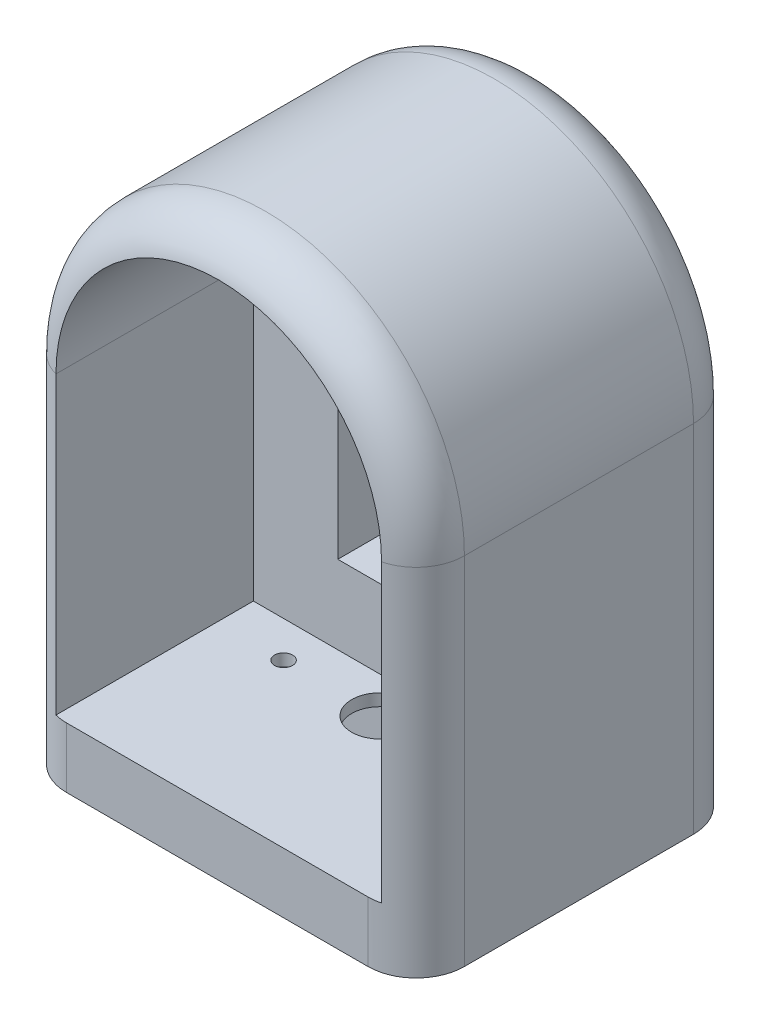
ISO-10303-21;
HEADER;
FILE_DESCRIPTION(('STEP AP214'),'2;1');
FILE_NAME('part.step','',(''),(''),'','','');
FILE_SCHEMA(('AUTOMOTIVE_DESIGN { 1 0 10303 214 1 1 1 1 }'));
ENDSEC;
DATA;
#1=APPLICATION_CONTEXT('core data for automotive mechanical design processes');
#2=APPLICATION_PROTOCOL_DEFINITION('international standard','automotive_design',2000,#1);
#3=PRODUCT_CONTEXT('',#1,'mechanical');
#4=PRODUCT('Part','Part','',(#3));
#5=PRODUCT_RELATED_PRODUCT_CATEGORY('part','',(#4));
#6=PRODUCT_DEFINITION_FORMATION('','',#4);
#7=PRODUCT_DEFINITION_CONTEXT('part definition',#1,'design');
#8=PRODUCT_DEFINITION('design','',#6,#7);
#9=PRODUCT_DEFINITION_SHAPE('','',#8);
#10=(LENGTH_UNIT() NAMED_UNIT(*) SI_UNIT(.MILLI.,.METRE.));
#11=(NAMED_UNIT(*) PLANE_ANGLE_UNIT() SI_UNIT($,.RADIAN.));
#12=(NAMED_UNIT(*) SI_UNIT($,.STERADIAN.) SOLID_ANGLE_UNIT());
#13=UNCERTAINTY_MEASURE_WITH_UNIT(LENGTH_MEASURE(1.E-05),#10,'distance_accuracy_value','');
#14=(GEOMETRIC_REPRESENTATION_CONTEXT(3) GLOBAL_UNCERTAINTY_ASSIGNED_CONTEXT((#13)) GLOBAL_UNIT_ASSIGNED_CONTEXT((#10,
#11,#12)) REPRESENTATION_CONTEXT('',''));
#15=CARTESIAN_POINT('',(0.,0.,0.));
#16=DIRECTION('',(0.,0.,1.));
#17=DIRECTION('',(1.,0.,0.));
#18=AXIS2_PLACEMENT_3D('',#15,#16,#17);
#19=CARTESIAN_POINT('',(-16.5,0.,-3.));
#20=DIRECTION('',(0.,0.,1.));
#21=DIRECTION('',(0.,-1.,0.));
#22=AXIS2_PLACEMENT_3D('',#19,#20,#21);
#23=PLANE('',#22);
#24=CARTESIAN_POINT('',(0.,36.8,-3.));
#25=DIRECTION('',(0.,0.,1.));
#26=DIRECTION('',(1.,0.,0.));
#27=AXIS2_PLACEMENT_3D('',#24,#25,#26);
#28=CIRCLE('',#27,1.);
#29=CARTESIAN_POINT('',(1.,36.8,-3.));
#30=VERTEX_POINT('',#29);
#31=EDGE_CURVE('E312',#30,#30,#28,.T.);
#32=ORIENTED_EDGE('',*,*,#31,.F.);
#33=EDGE_LOOP('',(#32));
#34=FACE_BOUND('',#33,.T.);
#35=CARTESIAN_POINT('',(0.,9.2,-3.));
#36=DIRECTION('',(0.,0.,1.));
#37=DIRECTION('',(1.,0.,0.));
#38=AXIS2_PLACEMENT_3D('',#35,#36,#37);
#39=CIRCLE('',#38,1.);
#40=CARTESIAN_POINT('',(1.,9.2,-3.));
#41=VERTEX_POINT('',#40);
#42=EDGE_CURVE('E315',#41,#41,#39,.T.);
#43=ORIENTED_EDGE('',*,*,#42,.F.);
#44=EDGE_LOOP('',(#43));
#45=FACE_BOUND('',#44,.T.);
#46=DIRECTION('',(0.,1.,0.));
#47=VECTOR('',#46,1.);
#48=CARTESIAN_POINT('',(6.5,11.5,-3.));
#49=LINE('',#48,#47);
#50=CARTESIAN_POINT('',(6.5,11.5,-3.));
#51=VERTEX_POINT('',#50);
#52=CARTESIAN_POINT('',(6.5,34.5,-3.));
#53=VERTEX_POINT('',#52);
#54=EDGE_CURVE('E322',#51,#53,#49,.T.);
#55=ORIENTED_EDGE('',*,*,#54,.F.);
#56=DIRECTION('',(1.,0.,0.));
#57=VECTOR('',#56,1.);
#58=CARTESIAN_POINT('',(-6.5,11.5,-3.));
#59=LINE('',#58,#57);
#60=CARTESIAN_POINT('',(-6.5,11.5,-3.));
#61=VERTEX_POINT('',#60);
#62=EDGE_CURVE('E344',#61,#51,#59,.T.);
#63=ORIENTED_EDGE('',*,*,#62,.F.);
#64=DIRECTION('',(0.,-1.,0.));
#65=VECTOR('',#64,1.);
#66=CARTESIAN_POINT('',(-6.5,11.5,-3.));
#67=LINE('',#66,#65);
#68=CARTESIAN_POINT('',(-6.5,34.5,-3.));
#69=VERTEX_POINT('',#68);
#70=EDGE_CURVE('E342',#69,#61,#67,.T.);
#71=ORIENTED_EDGE('',*,*,#70,.F.);
#72=DIRECTION('',(-1.,0.,0.));
#73=VECTOR('',#72,1.);
#74=CARTESIAN_POINT('',(-6.5,34.5,-3.));
#75=LINE('',#74,#73);
#76=EDGE_CURVE('E340',#53,#69,#75,.T.);
#77=ORIENTED_EDGE('',*,*,#76,.F.);
#78=EDGE_LOOP('',(#55,#63,#71,#77));
#79=FACE_BOUND('',#78,.T.);
#80=DIRECTION('',(1.,0.,0.));
#81=VECTOR('',#80,1.);
#82=CARTESIAN_POINT('',(-16.5,5.,-3.));
#83=LINE('',#82,#81);
#84=CARTESIAN_POINT('',(-13.5,5.,-3.));
#85=VERTEX_POINT('',#84);
#86=CARTESIAN_POINT('',(13.5,5.,-3.));
#87=VERTEX_POINT('',#86);
#88=EDGE_CURVE('E358',#85,#87,#83,.T.);
#89=ORIENTED_EDGE('',*,*,#88,.T.);
#90=DIRECTION('',(0.,-1.,0.));
#91=VECTOR('',#90,1.);
#92=CARTESIAN_POINT('',(13.5,8.,-3.));
#93=LINE('',#92,#91);
#94=CARTESIAN_POINT('',(13.5,29.5,-3.));
#95=VERTEX_POINT('',#94);
#96=EDGE_CURVE('E296',#95,#87,#93,.T.);
#97=ORIENTED_EDGE('',*,*,#96,.F.);
#98=CARTESIAN_POINT('',(0.,29.5,-3.));
#99=DIRECTION('',(0.,0.,-1.));
#100=DIRECTION('',(1.,0.,0.));
#101=AXIS2_PLACEMENT_3D('',#98,#99,#100);
#102=CIRCLE('',#101,13.5);
#103=CARTESIAN_POINT('',(-13.5,29.5,-3.));
#104=VERTEX_POINT('',#103);
#105=EDGE_CURVE('E292',#104,#95,#102,.T.);
#106=ORIENTED_EDGE('',*,*,#105,.F.);
#107=DIRECTION('',(0.,1.,0.));
#108=VECTOR('',#107,1.);
#109=CARTESIAN_POINT('',(-13.5,29.5,-3.));
#110=LINE('',#109,#108);
#111=EDGE_CURVE('E289',#85,#104,#110,.T.);
#112=ORIENTED_EDGE('',*,*,#111,.F.);
#113=EDGE_LOOP('',(#89,#97,#106,#112));
#114=FACE_BOUND('',#113,.T.);
#115=ADVANCED_FACE('F41',(#34,#45,#79,#114),#23,.T.);
#116=CARTESIAN_POINT('',(-16.5,5.,0.));
#117=DIRECTION('',(0.,-1.,0.));
#118=DIRECTION('',(0.,0.,-1.));
#119=AXIS2_PLACEMENT_3D('',#116,#117,#118);
#120=PLANE('',#119);
#121=CARTESIAN_POINT('',(8.,5.,0.));
#122=DIRECTION('',(0.,-1.,0.));
#123=DIRECTION('',(0.,0.,-1.));
#124=AXIS2_PLACEMENT_3D('',#121,#122,#123);
#125=CIRCLE('',#124,0.75);
#126=CARTESIAN_POINT('',(8.,5.,-0.75));
#127=VERTEX_POINT('',#126);
#128=EDGE_CURVE('E998',#127,#127,#125,.T.);
#129=ORIENTED_EDGE('',*,*,#128,.T.);
#130=EDGE_LOOP('',(#129));
#131=FACE_BOUND('',#130,.T.);
#132=CARTESIAN_POINT('',(-8.,5.,0.));
#133=DIRECTION('',(0.,-1.,0.));
#134=DIRECTION('',(0.,0.,-1.));
#135=AXIS2_PLACEMENT_3D('',#132,#133,#134);
#136=CIRCLE('',#135,0.75);
#137=CARTESIAN_POINT('',(-8.,5.,-0.75));
#138=VERTEX_POINT('',#137);
#139=EDGE_CURVE('E999',#138,#138,#136,.T.);
#140=ORIENTED_EDGE('',*,*,#139,.T.);
#141=EDGE_LOOP('',(#140));
#142=FACE_BOUND('',#141,.T.);
#143=CARTESIAN_POINT('',(0.,5.,0.));
#144=DIRECTION('',(0.,1.,0.));
#145=DIRECTION('',(0.,0.,1.));
#146=AXIS2_PLACEMENT_3D('',#143,#144,#145);
#147=CIRCLE('',#146,2.35);
#148=CARTESIAN_POINT('',(0.,5.,2.35));
#149=VERTEX_POINT('',#148);
#150=EDGE_CURVE('E241',#149,#149,#147,.T.);
#151=ORIENTED_EDGE('',*,*,#150,.F.);
#152=EDGE_LOOP('',(#151));
#153=FACE_BOUND('',#152,.T.);
#154=DIRECTION('',(0.,0.,-1.));
#155=VECTOR('',#154,1.);
#156=CARTESIAN_POINT('',(-13.5,5.,66.1307894677631));
#157=LINE('',#156,#155);
#158=CARTESIAN_POINT('',(-13.5,5.,13.3729833462074));
#159=VERTEX_POINT('',#158);
#160=EDGE_CURVE('E305',#159,#85,#157,.T.);
#161=ORIENTED_EDGE('',*,*,#160,.F.);
#162=CARTESIAN_POINT('',(-12.5,5.,9.5));
#163=DIRECTION('',(0.,-1.,0.));
#164=DIRECTION('',(0.,0.,-1.));
#165=AXIS2_PLACEMENT_3D('',#162,#163,#164);
#166=CIRCLE('',#165,4.);
#167=CARTESIAN_POINT('',(-12.5,5.,13.5));
#168=VERTEX_POINT('',#167);
#169=EDGE_CURVE('E414',#159,#168,#166,.F.);
#170=ORIENTED_EDGE('',*,*,#169,.T.);
#171=DIRECTION('',(1.,0.,0.));
#172=VECTOR('',#171,1.);
#173=CARTESIAN_POINT('',(-16.5,5.,13.5));
#174=LINE('',#173,#172);
#175=CARTESIAN_POINT('',(12.5,5.,13.5));
#176=VERTEX_POINT('',#175);
#177=EDGE_CURVE('E349',#168,#176,#174,.T.);
#178=ORIENTED_EDGE('',*,*,#177,.T.);
#179=CARTESIAN_POINT('',(12.5,5.,9.5));
#180=DIRECTION('',(0.,-1.,0.));
#181=DIRECTION('',(0.,0.,-1.));
#182=AXIS2_PLACEMENT_3D('',#179,#180,#181);
#183=CIRCLE('',#182,4.);
#184=CARTESIAN_POINT('',(13.5,5.,13.3729833462074));
#185=VERTEX_POINT('',#184);
#186=EDGE_CURVE('E412',#176,#185,#183,.F.);
#187=ORIENTED_EDGE('',*,*,#186,.T.);
#188=DIRECTION('',(0.,0.,-1.));
#189=VECTOR('',#188,1.);
#190=CARTESIAN_POINT('',(13.5,5.,66.1307894677631));
#191=LINE('',#190,#189);
#192=EDGE_CURVE('E299',#185,#87,#191,.T.);
#193=ORIENTED_EDGE('',*,*,#192,.T.);
#194=ORIENTED_EDGE('',*,*,#88,.F.);
#195=EDGE_LOOP('',(#161,#170,#178,#187,#193,#194));
#196=FACE_BOUND('',#195,.T.);
#197=ADVANCED_FACE('F515',(#131,#142,#153,#196),#120,.F.);
#198=CARTESIAN_POINT('',(0.,0.,-12.));
#199=DIRECTION('',(0.,0.,-1.));
#200=DIRECTION('',(-1.,0.,0.));
#201=AXIS2_PLACEMENT_3D('',#198,#199,#200);
#202=PLANE('',#201);
#203=DIRECTION('',(0.,-1.,0.));
#204=VECTOR('',#203,1.);
#205=CARTESIAN_POINT('',(-6.5,11.5,-12.));
#206=LINE('',#205,#204);
#207=CARTESIAN_POINT('',(-6.5,34.5,-12.));
#208=VERTEX_POINT('',#207);
#209=CARTESIAN_POINT('',(-6.5,28.,-12.));
#210=VERTEX_POINT('',#209);
#211=EDGE_CURVE('E332',#208,#210,#206,.T.);
#212=ORIENTED_EDGE('',*,*,#211,.T.);
#213=CARTESIAN_POINT('',(0.,28.,-12.));
#214=DIRECTION('',(0.,0.,-1.));
#215=DIRECTION('',(-1.,0.,0.));
#216=AXIS2_PLACEMENT_3D('',#213,#214,#215);
#217=CIRCLE('',#216,6.5);
#218=CARTESIAN_POINT('',(0.,34.5,-12.));
#219=VERTEX_POINT('',#218);
#220=EDGE_CURVE('E383',#210,#219,#217,.T.);
#221=ORIENTED_EDGE('',*,*,#220,.T.);
#222=DIRECTION('',(-1.,0.,0.));
#223=VECTOR('',#222,1.);
#224=CARTESIAN_POINT('',(-6.5,34.5,-12.));
#225=LINE('',#224,#223);
#226=EDGE_CURVE('E326',#219,#208,#225,.T.);
#227=ORIENTED_EDGE('',*,*,#226,.T.);
#228=EDGE_LOOP('',(#212,#221,#227));
#229=FACE_BOUND('',#228,.T.);
#230=ADVANCED_FACE('F513',(#229),#202,.F.);
#231=CARTESIAN_POINT('',(6.5,34.5,-12.));
#232=VERTEX_POINT('',#231);
#233=EDGE_CURVE('E328',#232,#219,#225,.T.);
#234=ORIENTED_EDGE('',*,*,#233,.T.);
#235=CARTESIAN_POINT('',(6.5,28.,-12.));
#236=VERTEX_POINT('',#235);
#237=EDGE_CURVE('E382',#219,#236,#217,.T.);
#238=ORIENTED_EDGE('',*,*,#237,.T.);
#239=DIRECTION('',(0.,1.,0.));
#240=VECTOR('',#239,1.);
#241=CARTESIAN_POINT('',(6.5,11.5,-12.));
#242=LINE('',#241,#240);
#243=EDGE_CURVE('E327',#236,#232,#242,.T.);
#244=ORIENTED_EDGE('',*,*,#243,.T.);
#245=EDGE_LOOP('',(#234,#238,#244));
#246=FACE_BOUND('',#245,.T.);
#247=ADVANCED_FACE('F489',(#246),#202,.F.);
#248=CARTESIAN_POINT('',(0.,29.5,-3.));
#249=DIRECTION('',(0.,0.,1.));
#250=DIRECTION('',(1.,0.,0.));
#251=AXIS2_PLACEMENT_3D('',#248,#249,#250);
#252=CYLINDRICAL_SURFACE('',#251,16.5);
#253=DIRECTION('',(0.,0.,1.));
#254=VECTOR('',#253,1.);
#255=CARTESIAN_POINT('',(-16.5,29.5,13.5));
#256=LINE('',#255,#254);
#257=CARTESIAN_POINT('',(-16.5,29.5,9.5));
#258=VERTEX_POINT('',#257);
#259=CARTESIAN_POINT('',(-16.5,29.5,-9.5));
#260=VERTEX_POINT('',#259);
#261=EDGE_CURVE('E373',#258,#260,#256,.F.);
#262=ORIENTED_EDGE('',*,*,#261,.F.);
#263=CARTESIAN_POINT('',(0.,29.5,9.5));
#264=DIRECTION('',(0.,0.,-1.));
#265=DIRECTION('',(-1.,0.,0.));
#266=AXIS2_PLACEMENT_3D('',#263,#264,#265);
#267=CIRCLE('',#266,16.5);
#268=CARTESIAN_POINT('',(16.5,29.5,9.5));
#269=VERTEX_POINT('',#268);
#270=EDGE_CURVE('E50',#258,#269,#267,.T.);
#271=ORIENTED_EDGE('',*,*,#270,.T.);
#272=DIRECTION('',(0.,0.,1.));
#273=VECTOR('',#272,1.);
#274=CARTESIAN_POINT('',(16.5,29.5,13.5));
#275=LINE('',#274,#273);
#276=CARTESIAN_POINT('',(16.5,29.5,-9.5));
#277=VERTEX_POINT('',#276);
#278=EDGE_CURVE('E376',#277,#269,#275,.T.);
#279=ORIENTED_EDGE('',*,*,#278,.F.);
#280=CARTESIAN_POINT('',(0.,29.5,-9.5));
#281=DIRECTION('',(0.,0.,1.));
#282=DIRECTION('',(1.,0.,0.));
#283=AXIS2_PLACEMENT_3D('',#280,#281,#282);
#284=CIRCLE('',#283,16.5);
#285=EDGE_CURVE('E419',#277,#260,#284,.T.);
#286=ORIENTED_EDGE('',*,*,#285,.T.);
#287=EDGE_LOOP('',(#262,#271,#279,#286));
#288=FACE_BOUND('',#287,.T.);
#289=ADVANCED_FACE('F457',(#288),#252,.T.);
#290=CARTESIAN_POINT('',(16.5,46.,13.5));
#291=DIRECTION('',(-1.,0.,0.));
#292=DIRECTION('',(0.,0.,1.));
#293=AXIS2_PLACEMENT_3D('',#290,#291,#292);
#294=PLANE('',#293);
#295=DIRECTION('',(0.,0.,-1.));
#296=VECTOR('',#295,1.);
#297=CARTESIAN_POINT('',(16.5,0.,13.5));
#298=LINE('',#297,#296);
#299=CARTESIAN_POINT('',(16.5,0.,9.5));
#300=VERTEX_POINT('',#299);
#301=CARTESIAN_POINT('',(16.5,0.,-9.5));
#302=VERTEX_POINT('',#301);
#303=EDGE_CURVE('E361',#300,#302,#298,.T.);
#304=ORIENTED_EDGE('',*,*,#303,.T.);
#305=DIRECTION('',(0.,-1.,0.));
#306=VECTOR('',#305,1.);
#307=CARTESIAN_POINT('',(16.5,46.,-9.5));
#308=LINE('',#307,#306);
#309=EDGE_CURVE('E405',#302,#277,#308,.F.);
#310=ORIENTED_EDGE('',*,*,#309,.T.);
#311=ORIENTED_EDGE('',*,*,#278,.T.);
#312=DIRECTION('',(0.,-1.,0.));
#313=VECTOR('',#312,1.);
#314=CARTESIAN_POINT('',(16.5,46.,9.5));
#315=LINE('',#314,#313);
#316=EDGE_CURVE('E403',#269,#300,#315,.T.);
#317=ORIENTED_EDGE('',*,*,#316,.T.);
#318=EDGE_LOOP('',(#304,#310,#311,#317));
#319=FACE_BOUND('',#318,.T.);
#320=ADVANCED_FACE('F441',(#319),#294,.F.);
#321=CARTESIAN_POINT('',(-16.5,46.,13.5));
#322=DIRECTION('',(1.,0.,0.));
#323=DIRECTION('',(0.,0.,-1.));
#324=AXIS2_PLACEMENT_3D('',#321,#322,#323);
#325=PLANE('',#324);
#326=ORIENTED_EDGE('',*,*,#261,.T.);
#327=DIRECTION('',(0.,-1.,0.));
#328=VECTOR('',#327,1.);
#329=CARTESIAN_POINT('',(-16.5,46.,-9.5));
#330=LINE('',#329,#328);
#331=CARTESIAN_POINT('',(-16.5,0.,-9.5));
#332=VERTEX_POINT('',#331);
#333=EDGE_CURVE('E386',#260,#332,#330,.T.);
#334=ORIENTED_EDGE('',*,*,#333,.T.);
#335=DIRECTION('',(0.,0.,1.));
#336=VECTOR('',#335,1.);
#337=CARTESIAN_POINT('',(-16.5,0.,13.5));
#338=LINE('',#337,#336);
#339=CARTESIAN_POINT('',(-16.5,0.,9.5));
#340=VERTEX_POINT('',#339);
#341=EDGE_CURVE('E368',#332,#340,#338,.T.);
#342=ORIENTED_EDGE('',*,*,#341,.T.);
#343=DIRECTION('',(0.,-1.,0.));
#344=VECTOR('',#343,1.);
#345=CARTESIAN_POINT('',(-16.5,46.,9.5));
#346=LINE('',#345,#344);
#347=EDGE_CURVE('E384',#340,#258,#346,.F.);
#348=ORIENTED_EDGE('',*,*,#347,.T.);
#349=EDGE_LOOP('',(#326,#334,#342,#348));
#350=FACE_BOUND('',#349,.T.);
#351=ADVANCED_FACE('F460',(#350),#325,.F.);
#352=CARTESIAN_POINT('',(-16.5,46.,-13.5));
#353=DIRECTION('',(0.,0.,1.));
#354=DIRECTION('',(1.,0.,0.));
#355=AXIS2_PLACEMENT_3D('',#352,#353,#354);
#356=PLANE('',#355);
#357=DIRECTION('',(-1.,0.,0.));
#358=VECTOR('',#357,1.);
#359=CARTESIAN_POINT('',(-16.5,0.,-13.5));
#360=LINE('',#359,#358);
#361=CARTESIAN_POINT('',(12.5,0.,-13.5));
#362=VERTEX_POINT('',#361);
#363=CARTESIAN_POINT('',(-12.5,0.,-13.5));
#364=VERTEX_POINT('',#363);
#365=EDGE_CURVE('E365',#362,#364,#360,.T.);
#366=ORIENTED_EDGE('',*,*,#365,.T.);
#367=DIRECTION('',(0.,-1.,0.));
#368=VECTOR('',#367,1.);
#369=CARTESIAN_POINT('',(-12.5,46.,-13.5));
#370=LINE('',#369,#368);
#371=CARTESIAN_POINT('',(-12.5,29.5,-13.5));
#372=VERTEX_POINT('',#371);
#373=EDGE_CURVE('E401',#364,#372,#370,.F.);
#374=ORIENTED_EDGE('',*,*,#373,.T.);
#375=CARTESIAN_POINT('',(0.,29.5,-13.5));
#376=DIRECTION('',(0.,0.,1.));
#377=DIRECTION('',(1.,0.,0.));
#378=AXIS2_PLACEMENT_3D('',#375,#376,#377);
#379=CIRCLE('',#378,12.5);
#380=CARTESIAN_POINT('',(12.5,29.5,-13.5));
#381=VERTEX_POINT('',#380);
#382=EDGE_CURVE('E397',#372,#381,#379,.F.);
#383=ORIENTED_EDGE('',*,*,#382,.T.);
#384=DIRECTION('',(0.,-1.,0.));
#385=VECTOR('',#384,1.);
#386=CARTESIAN_POINT('',(12.5,46.,-13.5));
#387=LINE('',#386,#385);
#388=EDGE_CURVE('E399',#381,#362,#387,.T.);
#389=ORIENTED_EDGE('',*,*,#388,.T.);
#390=EDGE_LOOP('',(#366,#374,#383,#389));
#391=FACE_BOUND('',#390,.T.);
#392=CARTESIAN_POINT('',(0.,28.,-13.5));
#393=DIRECTION('',(0.,0.,1.));
#394=DIRECTION('',(1.,0.,0.));
#395=AXIS2_PLACEMENT_3D('',#392,#393,#394);
#396=CIRCLE('',#395,6.5);
#397=CARTESIAN_POINT('',(6.5,28.,-13.5));
#398=VERTEX_POINT('',#397);
#399=EDGE_CURVE('E311',#398,#398,#396,.T.);
#400=ORIENTED_EDGE('',*,*,#399,.T.);
#401=EDGE_LOOP('',(#400));
#402=FACE_BOUND('',#401,.T.);
#403=ADVANCED_FACE('F470',(#391,#402),#356,.F.);
#404=CARTESIAN_POINT('',(-16.5,46.,13.5));
#405=DIRECTION('',(0.,0.,-1.));
#406=DIRECTION('',(-1.,0.,0.));
#407=AXIS2_PLACEMENT_3D('',#404,#405,#406);
#408=PLANE('',#407);
#409=ORIENTED_EDGE('',*,*,#177,.F.);
#410=DIRECTION('',(0.,-1.,0.));
#411=VECTOR('',#410,1.);
#412=CARTESIAN_POINT('',(-12.5,46.,13.5));
#413=LINE('',#412,#411);
#414=CARTESIAN_POINT('',(-12.5,0.,13.5));
#415=VERTEX_POINT('',#414);
#416=EDGE_CURVE('E417',#168,#415,#413,.T.);
#417=ORIENTED_EDGE('',*,*,#416,.T.);
#418=DIRECTION('',(1.,0.,0.));
#419=VECTOR('',#418,1.);
#420=CARTESIAN_POINT('',(-16.5,0.,13.5));
#421=LINE('',#420,#419);
#422=CARTESIAN_POINT('',(12.5,0.,13.5));
#423=VERTEX_POINT('',#422);
#424=EDGE_CURVE('E371',#415,#423,#421,.T.);
#425=ORIENTED_EDGE('',*,*,#424,.T.);
#426=DIRECTION('',(0.,-1.,0.));
#427=VECTOR('',#426,1.);
#428=CARTESIAN_POINT('',(12.5,46.,13.5));
#429=LINE('',#428,#427);
#430=EDGE_CURVE('E66',#423,#176,#429,.F.);
#431=ORIENTED_EDGE('',*,*,#430,.T.);
#432=EDGE_LOOP('',(#409,#417,#425,#431));
#433=FACE_BOUND('',#432,.T.);
#434=ADVANCED_FACE('F473',(#433),#408,.F.);
#435=CARTESIAN_POINT('',(0.,0.,0.));
#436=DIRECTION('',(0.,-1.,0.));
#437=DIRECTION('',(0.,0.,-1.));
#438=AXIS2_PLACEMENT_3D('',#435,#436,#437);
#439=PLANE('',#438);
#440=CARTESIAN_POINT('',(14.,0.,0.));
#441=DIRECTION('',(0.,-1.,0.));
#442=DIRECTION('',(0.,0.,-1.));
#443=AXIS2_PLACEMENT_3D('',#440,#441,#442);
#444=CIRCLE('',#443,1.75);
#445=CARTESIAN_POINT('',(14.09375,0.,-1.74748703500198));
#446=VERTEX_POINT('',#445);
#447=CARTESIAN_POINT('',(14.09375,0.,1.74748703500198));
#448=VERTEX_POINT('',#447);
#449=EDGE_CURVE('E58',#446,#448,#444,.T.);
#450=ORIENTED_EDGE('',*,*,#449,.F.);
#451=DIRECTION('',(0.99856402000113,0.,0.0535714285714287));
#452=VECTOR('',#451,1.);
#453=CARTESIAN_POINT('',(14.09375,0.,-1.74748703500198));
#454=LINE('',#453,#452);
#455=CARTESIAN_POINT('',(0.133928571428572,0.,-2.49641005000282));
#456=VERTEX_POINT('',#455);
#457=EDGE_CURVE('E235',#456,#446,#454,.T.);
#458=ORIENTED_EDGE('',*,*,#457,.F.);
#459=CARTESIAN_POINT('',(0.,0.,0.));
#460=DIRECTION('',(0.,-1.,0.));
#461=DIRECTION('',(0.,0.,-1.));
#462=AXIS2_PLACEMENT_3D('',#459,#460,#461);
#463=CIRCLE('',#462,2.5);
#464=CARTESIAN_POINT('',(-0.133928571428571,0.,-2.49641005000282));
#465=VERTEX_POINT('',#464);
#466=EDGE_CURVE('E238',#465,#456,#463,.T.);
#467=ORIENTED_EDGE('',*,*,#466,.F.);
#468=DIRECTION('',(0.99856402000113,0.,-0.0535714285714285));
#469=VECTOR('',#468,1.);
#470=CARTESIAN_POINT('',(-0.133928571428571,0.,-2.49641005000282));
#471=LINE('',#470,#469);
#472=CARTESIAN_POINT('',(-14.09375,0.,-1.74748703500198));
#473=VERTEX_POINT('',#472);
#474=EDGE_CURVE('E270',#473,#465,#471,.T.);
#475=ORIENTED_EDGE('',*,*,#474,.F.);
#476=CARTESIAN_POINT('',(-14.,0.,0.));
#477=DIRECTION('',(0.,-1.,0.));
#478=DIRECTION('',(0.,0.,-1.));
#479=AXIS2_PLACEMENT_3D('',#476,#477,#478);
#480=CIRCLE('',#479,1.75);
#481=CARTESIAN_POINT('',(-14.09375,0.,1.74748703500198));
#482=VERTEX_POINT('',#481);
#483=EDGE_CURVE('E267',#482,#473,#480,.T.);
#484=ORIENTED_EDGE('',*,*,#483,.F.);
#485=DIRECTION('',(-0.99856402000113,0.,-0.0535714285714286));
#486=VECTOR('',#485,1.);
#487=CARTESIAN_POINT('',(-14.09375,0.,1.74748703500198));
#488=LINE('',#487,#486);
#489=CARTESIAN_POINT('',(-0.133928571428571,0.,2.49641005000282));
#490=VERTEX_POINT('',#489);
#491=EDGE_CURVE('E264',#490,#482,#488,.T.);
#492=ORIENTED_EDGE('',*,*,#491,.F.);
#493=CARTESIAN_POINT('',(0.,0.,0.));
#494=DIRECTION('',(0.,-1.,0.));
#495=DIRECTION('',(0.,0.,-1.));
#496=AXIS2_PLACEMENT_3D('',#493,#494,#495);
#497=CIRCLE('',#496,2.5);
#498=CARTESIAN_POINT('',(0.133928571428571,0.,2.49641005000282));
#499=VERTEX_POINT('',#498);
#500=EDGE_CURVE('E261',#499,#490,#497,.T.);
#501=ORIENTED_EDGE('',*,*,#500,.F.);
#502=DIRECTION('',(-0.99856402000113,0.,0.0535714285714286));
#503=VECTOR('',#502,1.);
#504=CARTESIAN_POINT('',(0.133928571428571,0.,2.49641005000282));
#505=LINE('',#504,#503);
#506=EDGE_CURVE('E258',#448,#499,#505,.T.);
#507=ORIENTED_EDGE('',*,*,#506,.F.);
#508=EDGE_LOOP('',(#450,#458,#467,#475,#484,#492,#501,#507));
#509=FACE_BOUND('',#508,.T.);
#510=ORIENTED_EDGE('',*,*,#341,.F.);
#511=CARTESIAN_POINT('',(-12.5,0.,-9.5));
#512=DIRECTION('',(0.,-1.,0.));
#513=DIRECTION('',(0.,0.,-1.));
#514=AXIS2_PLACEMENT_3D('',#511,#512,#513);
#515=CIRCLE('',#514,4.);
#516=EDGE_CURVE('E395',#332,#364,#515,.T.);
#517=ORIENTED_EDGE('',*,*,#516,.T.);
#518=ORIENTED_EDGE('',*,*,#365,.F.);
#519=CARTESIAN_POINT('',(12.5,0.,-9.5));
#520=DIRECTION('',(0.,-1.,0.));
#521=DIRECTION('',(0.,0.,-1.));
#522=AXIS2_PLACEMENT_3D('',#519,#520,#521);
#523=CIRCLE('',#522,4.);
#524=EDGE_CURVE('E393',#362,#302,#523,.T.);
#525=ORIENTED_EDGE('',*,*,#524,.T.);
#526=ORIENTED_EDGE('',*,*,#303,.F.);
#527=CARTESIAN_POINT('',(12.5,0.,9.5));
#528=DIRECTION('',(0.,-1.,0.));
#529=DIRECTION('',(0.,0.,-1.));
#530=AXIS2_PLACEMENT_3D('',#527,#528,#529);
#531=CIRCLE('',#530,4.);
#532=EDGE_CURVE('E389',#300,#423,#531,.T.);
#533=ORIENTED_EDGE('',*,*,#532,.T.);
#534=ORIENTED_EDGE('',*,*,#424,.F.);
#535=CARTESIAN_POINT('',(-12.5,0.,9.5));
#536=DIRECTION('',(0.,-1.,0.));
#537=DIRECTION('',(0.,0.,-1.));
#538=AXIS2_PLACEMENT_3D('',#535,#536,#537);
#539=CIRCLE('',#538,4.);
#540=EDGE_CURVE('E391',#415,#340,#539,.T.);
#541=ORIENTED_EDGE('',*,*,#540,.T.);
#542=EDGE_LOOP('',(#510,#517,#518,#525,#526,#533,#534,#541));
#543=FACE_BOUND('',#542,.T.);
#544=ADVANCED_FACE('F446',(#509,#543),#439,.T.);
#545=CARTESIAN_POINT('',(6.5,11.5,-12.));
#546=DIRECTION('',(1.,0.,0.));
#547=DIRECTION('',(0.,0.,-1.));
#548=AXIS2_PLACEMENT_3D('',#545,#546,#547);
#549=PLANE('',#548);
#550=ORIENTED_EDGE('',*,*,#243,.F.);
#551=CARTESIAN_POINT('',(6.5,11.5,-12.));
#552=VERTEX_POINT('',#551);
#553=EDGE_CURVE('E323',#552,#236,#242,.T.);
#554=ORIENTED_EDGE('',*,*,#553,.F.);
#555=DIRECTION('',(0.,0.,1.));
#556=VECTOR('',#555,1.);
#557=CARTESIAN_POINT('',(6.5,11.5,-12.));
#558=LINE('',#557,#556);
#559=EDGE_CURVE('E347',#552,#51,#558,.T.);
#560=ORIENTED_EDGE('',*,*,#559,.T.);
#561=ORIENTED_EDGE('',*,*,#54,.T.);
#562=DIRECTION('',(0.,0.,1.));
#563=VECTOR('',#562,1.);
#564=CARTESIAN_POINT('',(6.5,34.5,-12.));
#565=LINE('',#564,#563);
#566=EDGE_CURVE('E338',#232,#53,#565,.T.);
#567=ORIENTED_EDGE('',*,*,#566,.F.);
#568=EDGE_LOOP('',(#550,#554,#560,#561,#567));
#569=FACE_BOUND('',#568,.T.);
#570=ADVANCED_FACE('F494',(#569),#549,.F.);
#571=CARTESIAN_POINT('',(-6.5,11.5,-12.));
#572=DIRECTION('',(0.,-1.,0.));
#573=DIRECTION('',(0.,0.,-1.));
#574=AXIS2_PLACEMENT_3D('',#571,#572,#573);
#575=PLANE('',#574);
#576=ORIENTED_EDGE('',*,*,#62,.T.);
#577=ORIENTED_EDGE('',*,*,#559,.F.);
#578=DIRECTION('',(1.,0.,0.));
#579=VECTOR('',#578,1.);
#580=CARTESIAN_POINT('',(-6.5,11.5,-12.));
#581=LINE('',#580,#579);
#582=CARTESIAN_POINT('',(-6.5,11.5,-12.));
#583=VERTEX_POINT('',#582);
#584=EDGE_CURVE('E335',#583,#552,#581,.T.);
#585=ORIENTED_EDGE('',*,*,#584,.F.);
#586=DIRECTION('',(0.,0.,1.));
#587=VECTOR('',#586,1.);
#588=CARTESIAN_POINT('',(-6.5,11.5,-12.));
#589=LINE('',#588,#587);
#590=EDGE_CURVE('E350',#583,#61,#589,.T.);
#591=ORIENTED_EDGE('',*,*,#590,.T.);
#592=EDGE_LOOP('',(#576,#577,#585,#591));
#593=FACE_BOUND('',#592,.T.);
#594=ADVANCED_FACE('F498',(#593),#575,.F.);
#595=CARTESIAN_POINT('',(-6.5,11.5,-12.));
#596=DIRECTION('',(-1.,0.,0.));
#597=DIRECTION('',(0.,0.,1.));
#598=AXIS2_PLACEMENT_3D('',#595,#596,#597);
#599=PLANE('',#598);
#600=EDGE_CURVE('E331',#210,#583,#206,.T.);
#601=ORIENTED_EDGE('',*,*,#600,.F.);
#602=ORIENTED_EDGE('',*,*,#211,.F.);
#603=DIRECTION('',(0.,0.,1.));
#604=VECTOR('',#603,1.);
#605=CARTESIAN_POINT('',(-6.5,34.5,-12.));
#606=LINE('',#605,#604);
#607=EDGE_CURVE('E353',#208,#69,#606,.T.);
#608=ORIENTED_EDGE('',*,*,#607,.T.);
#609=ORIENTED_EDGE('',*,*,#70,.T.);
#610=ORIENTED_EDGE('',*,*,#590,.F.);
#611=EDGE_LOOP('',(#601,#602,#608,#609,#610));
#612=FACE_BOUND('',#611,.T.);
#613=ADVANCED_FACE('F510',(#612),#599,.F.);
#614=CARTESIAN_POINT('',(-6.5,34.5,-12.));
#615=DIRECTION('',(0.,1.,0.));
#616=DIRECTION('',(0.,0.,1.));
#617=AXIS2_PLACEMENT_3D('',#614,#615,#616);
#618=PLANE('',#617);
#619=ORIENTED_EDGE('',*,*,#226,.F.);
#620=ORIENTED_EDGE('',*,*,#233,.F.);
#621=ORIENTED_EDGE('',*,*,#566,.T.);
#622=ORIENTED_EDGE('',*,*,#76,.T.);
#623=ORIENTED_EDGE('',*,*,#607,.F.);
#624=EDGE_LOOP('',(#619,#620,#621,#622,#623));
#625=FACE_BOUND('',#624,.T.);
#626=ADVANCED_FACE('F505',(#625),#618,.F.);
#627=ORIENTED_EDGE('',*,*,#553,.T.);
#628=EDGE_CURVE('E379',#236,#210,#217,.T.);
#629=ORIENTED_EDGE('',*,*,#628,.T.);
#630=ORIENTED_EDGE('',*,*,#600,.T.);
#631=ORIENTED_EDGE('',*,*,#584,.T.);
#632=EDGE_LOOP('',(#627,#629,#630,#631));
#633=FACE_BOUND('',#632,.T.);
#634=ADVANCED_FACE('F481',(#633),#202,.F.);
#635=CARTESIAN_POINT('',(0.,28.,-13.5));
#636=DIRECTION('',(0.,0.,1.));
#637=DIRECTION('',(1.,0.,0.));
#638=AXIS2_PLACEMENT_3D('',#635,#636,#637);
#639=CYLINDRICAL_SURFACE('',#638,6.5);
#640=ORIENTED_EDGE('',*,*,#399,.F.);
#641=EDGE_LOOP('',(#640));
#642=FACE_BOUND('',#641,.T.);
#643=ORIENTED_EDGE('',*,*,#628,.F.);
#644=ORIENTED_EDGE('',*,*,#237,.F.);
#645=ORIENTED_EDGE('',*,*,#220,.F.);
#646=EDGE_LOOP('',(#643,#644,#645));
#647=FACE_BOUND('',#646,.T.);
#648=ADVANCED_FACE('F477',(#642,#647),#639,.F.);
#649=CARTESIAN_POINT('',(0.,9.2,-11.));
#650=DIRECTION('',(0.,0.,1.));
#651=DIRECTION('',(1.,0.,0.));
#652=AXIS2_PLACEMENT_3D('',#649,#650,#651);
#653=CYLINDRICAL_SURFACE('',#652,1.);
#654=CARTESIAN_POINT('',(0.,9.2,-11.));
#655=DIRECTION('',(0.,0.,1.));
#656=DIRECTION('',(1.,0.,0.));
#657=AXIS2_PLACEMENT_3D('',#654,#655,#656);
#658=CIRCLE('',#657,1.);
#659=CARTESIAN_POINT('',(1.,9.2,-11.));
#660=VERTEX_POINT('',#659);
#661=EDGE_CURVE('E307',#660,#660,#658,.T.);
#662=ORIENTED_EDGE('',*,*,#661,.F.);
#663=EDGE_LOOP('',(#662));
#664=FACE_BOUND('',#663,.T.);
#665=ORIENTED_EDGE('',*,*,#42,.T.);
#666=EDGE_LOOP('',(#665));
#667=FACE_BOUND('',#666,.T.);
#668=ADVANCED_FACE('F480',(#664,#667),#653,.F.);
#669=CARTESIAN_POINT('',(0.,9.2,-11.));
#670=DIRECTION('',(0.,0.,1.));
#671=DIRECTION('',(1.,0.,0.));
#672=AXIS2_PLACEMENT_3D('',#669,#670,#671);
#673=PLANE('',#672);
#674=ORIENTED_EDGE('',*,*,#661,.T.);
#675=EDGE_LOOP('',(#674));
#676=FACE_BOUND('',#675,.T.);
#677=ADVANCED_FACE('F594',(#676),#673,.T.);
#678=CARTESIAN_POINT('',(0.,36.8,-11.));
#679=DIRECTION('',(0.,0.,1.));
#680=DIRECTION('',(1.,0.,0.));
#681=AXIS2_PLACEMENT_3D('',#678,#679,#680);
#682=CYLINDRICAL_SURFACE('',#681,1.);
#683=CARTESIAN_POINT('',(0.,36.8,-11.));
#684=DIRECTION('',(0.,0.,1.));
#685=DIRECTION('',(1.,0.,0.));
#686=AXIS2_PLACEMENT_3D('',#683,#684,#685);
#687=CIRCLE('',#686,1.);
#688=CARTESIAN_POINT('',(1.,36.8,-11.));
#689=VERTEX_POINT('',#688);
#690=EDGE_CURVE('E308',#689,#689,#687,.T.);
#691=ORIENTED_EDGE('',*,*,#690,.F.);
#692=EDGE_LOOP('',(#691));
#693=FACE_BOUND('',#692,.T.);
#694=ORIENTED_EDGE('',*,*,#31,.T.);
#695=EDGE_LOOP('',(#694));
#696=FACE_BOUND('',#695,.T.);
#697=ADVANCED_FACE('F590',(#693,#696),#682,.F.);
#698=CARTESIAN_POINT('',(0.,36.8,-11.));
#699=DIRECTION('',(0.,0.,1.));
#700=DIRECTION('',(1.,0.,0.));
#701=AXIS2_PLACEMENT_3D('',#698,#699,#700);
#702=PLANE('',#701);
#703=ORIENTED_EDGE('',*,*,#690,.T.);
#704=EDGE_LOOP('',(#703));
#705=FACE_BOUND('',#704,.T.);
#706=ADVANCED_FACE('F587',(#705),#702,.T.);
#707=CARTESIAN_POINT('',(13.5,8.,66.1307894677631));
#708=DIRECTION('',(1.,0.,0.));
#709=DIRECTION('',(0.,0.,-1.));
#710=AXIS2_PLACEMENT_3D('',#707,#708,#709);
#711=PLANE('',#710);
#712=ORIENTED_EDGE('',*,*,#192,.F.);
#713=DIRECTION('',(0.,-1.,0.));
#714=VECTOR('',#713,1.);
#715=CARTESIAN_POINT('',(13.5,46.,13.3729833462074));
#716=LINE('',#715,#714);
#717=CARTESIAN_POINT('',(13.5,29.5,13.3729833462074));
#718=VERTEX_POINT('',#717);
#719=EDGE_CURVE('E11',#185,#718,#716,.F.);
#720=ORIENTED_EDGE('',*,*,#719,.T.);
#721=DIRECTION('',(0.,0.,-1.));
#722=VECTOR('',#721,1.);
#723=CARTESIAN_POINT('',(13.5,29.5,66.1307894677631));
#724=LINE('',#723,#722);
#725=EDGE_CURVE('E301',#718,#95,#724,.T.);
#726=ORIENTED_EDGE('',*,*,#725,.T.);
#727=ORIENTED_EDGE('',*,*,#96,.T.);
#728=EDGE_LOOP('',(#712,#720,#726,#727));
#729=FACE_BOUND('',#728,.T.);
#730=ADVANCED_FACE('F570',(#729),#711,.F.);
#731=CARTESIAN_POINT('',(0.,29.5,66.1307894677631));
#732=DIRECTION('',(0.,0.,-1.));
#733=DIRECTION('',(-1.,0.,0.));
#734=AXIS2_PLACEMENT_3D('',#731,#732,#733);
#735=CYLINDRICAL_SURFACE('',#734,13.5);
#736=ORIENTED_EDGE('',*,*,#725,.F.);
#737=CARTESIAN_POINT('',(0.,29.5,13.3729833462074));
#738=DIRECTION('',(0.,0.,-1.));
#739=DIRECTION('',(-1.,0.,0.));
#740=AXIS2_PLACEMENT_3D('',#737,#738,#739);
#741=CIRCLE('',#740,13.5);
#742=CARTESIAN_POINT('',(-13.5,29.5,13.3729833462074));
#743=VERTEX_POINT('',#742);
#744=EDGE_CURVE('E407',#718,#743,#741,.F.);
#745=ORIENTED_EDGE('',*,*,#744,.T.);
#746=DIRECTION('',(0.,0.,-1.));
#747=VECTOR('',#746,1.);
#748=CARTESIAN_POINT('',(-13.5,29.5,66.1307894677631));
#749=LINE('',#748,#747);
#750=EDGE_CURVE('E303',#743,#104,#749,.T.);
#751=ORIENTED_EDGE('',*,*,#750,.T.);
#752=ORIENTED_EDGE('',*,*,#105,.T.);
#753=EDGE_LOOP('',(#736,#745,#751,#752));
#754=FACE_BOUND('',#753,.T.);
#755=ADVANCED_FACE('F576',(#754),#735,.F.);
#756=CARTESIAN_POINT('',(-13.5,29.5,66.1307894677631));
#757=DIRECTION('',(-1.,0.,0.));
#758=DIRECTION('',(0.,0.,1.));
#759=AXIS2_PLACEMENT_3D('',#756,#757,#758);
#760=PLANE('',#759);
#761=ORIENTED_EDGE('',*,*,#750,.F.);
#762=DIRECTION('',(0.,-1.,0.));
#763=VECTOR('',#762,1.);
#764=CARTESIAN_POINT('',(-13.5,46.,13.3729833462074));
#765=LINE('',#764,#763);
#766=EDGE_CURVE('E410',#743,#159,#765,.T.);
#767=ORIENTED_EDGE('',*,*,#766,.T.);
#768=ORIENTED_EDGE('',*,*,#160,.T.);
#769=ORIENTED_EDGE('',*,*,#111,.T.);
#770=EDGE_LOOP('',(#761,#767,#768,#769));
#771=FACE_BOUND('',#770,.T.);
#772=ADVANCED_FACE('F554',(#771),#760,.F.);
#773=CARTESIAN_POINT('',(12.5,46.,-9.5));
#774=DIRECTION('',(0.,-1.,0.));
#775=DIRECTION('',(0.,0.,-1.));
#776=AXIS2_PLACEMENT_3D('',#773,#774,#775);
#777=CYLINDRICAL_SURFACE('',#776,4.);
#778=ORIENTED_EDGE('',*,*,#524,.F.);
#779=ORIENTED_EDGE('',*,*,#388,.F.);
#780=CARTESIAN_POINT('',(12.5,29.5,-9.5));
#781=DIRECTION('',(0.,1.,0.));
#782=DIRECTION('',(0.,0.,1.));
#783=AXIS2_PLACEMENT_3D('',#780,#781,#782);
#784=CIRCLE('',#783,4.);
#785=EDGE_CURVE('E293',#277,#381,#784,.T.);
#786=ORIENTED_EDGE('',*,*,#785,.F.);
#787=ORIENTED_EDGE('',*,*,#309,.F.);
#788=EDGE_LOOP('',(#778,#779,#786,#787));
#789=FACE_BOUND('',#788,.T.);
#790=ADVANCED_FACE('F452',(#789),#777,.T.);
#791=CARTESIAN_POINT('',(0.,29.5,-9.5));
#792=DIRECTION('',(0.,0.,1.));
#793=DIRECTION('',(1.,0.,0.));
#794=AXIS2_PLACEMENT_3D('',#791,#792,#793);
#795=TOROIDAL_SURFACE('',#794,12.5,4.);
#796=ORIENTED_EDGE('',*,*,#785,.T.);
#797=ORIENTED_EDGE('',*,*,#382,.F.);
#798=CARTESIAN_POINT('',(-12.5,29.5,-9.5));
#799=DIRECTION('',(0.,-1.,0.));
#800=DIRECTION('',(0.,0.,-1.));
#801=AXIS2_PLACEMENT_3D('',#798,#799,#800);
#802=CIRCLE('',#801,4.);
#803=EDGE_CURVE('E422',#260,#372,#802,.T.);
#804=ORIENTED_EDGE('',*,*,#803,.F.);
#805=ORIENTED_EDGE('',*,*,#285,.F.);
#806=EDGE_LOOP('',(#796,#797,#804,#805));
#807=FACE_BOUND('',#806,.T.);
#808=ADVANCED_FACE('F465',(#807),#795,.T.);
#809=CARTESIAN_POINT('',(-12.5,46.,-9.5));
#810=DIRECTION('',(0.,-1.,0.));
#811=DIRECTION('',(0.,0.,-1.));
#812=AXIS2_PLACEMENT_3D('',#809,#810,#811);
#813=CYLINDRICAL_SURFACE('',#812,4.);
#814=ORIENTED_EDGE('',*,*,#803,.T.);
#815=ORIENTED_EDGE('',*,*,#373,.F.);
#816=ORIENTED_EDGE('',*,*,#516,.F.);
#817=ORIENTED_EDGE('',*,*,#333,.F.);
#818=EDGE_LOOP('',(#814,#815,#816,#817));
#819=FACE_BOUND('',#818,.T.);
#820=ADVANCED_FACE('F468',(#819),#813,.T.);
#821=CARTESIAN_POINT('',(12.5,46.,9.5));
#822=DIRECTION('',(0.,-1.,0.));
#823=DIRECTION('',(0.,0.,-1.));
#824=AXIS2_PLACEMENT_3D('',#821,#822,#823);
#825=CYLINDRICAL_SURFACE('',#824,4.);
#826=ORIENTED_EDGE('',*,*,#532,.F.);
#827=ORIENTED_EDGE('',*,*,#316,.F.);
#828=CARTESIAN_POINT('',(12.5,29.5,9.5));
#829=DIRECTION('',(0.,1.,0.));
#830=DIRECTION('',(0.,0.,1.));
#831=AXIS2_PLACEMENT_3D('',#828,#829,#830);
#832=CIRCLE('',#831,4.);
#833=EDGE_CURVE('E45',#718,#269,#832,.T.);
#834=ORIENTED_EDGE('',*,*,#833,.F.);
#835=ORIENTED_EDGE('',*,*,#719,.F.);
#836=ORIENTED_EDGE('',*,*,#186,.F.);
#837=ORIENTED_EDGE('',*,*,#430,.F.);
#838=EDGE_LOOP('',(#826,#827,#834,#835,#836,#837));
#839=FACE_BOUND('',#838,.T.);
#840=ADVANCED_FACE('F43',(#839),#825,.T.);
#841=CARTESIAN_POINT('',(-12.5,46.,9.5));
#842=DIRECTION('',(0.,-1.,0.));
#843=DIRECTION('',(0.,0.,-1.));
#844=AXIS2_PLACEMENT_3D('',#841,#842,#843);
#845=CYLINDRICAL_SURFACE('',#844,4.);
#846=ORIENTED_EDGE('',*,*,#169,.F.);
#847=ORIENTED_EDGE('',*,*,#766,.F.);
#848=CARTESIAN_POINT('',(-12.5,29.5,9.5));
#849=DIRECTION('',(0.,1.,0.));
#850=DIRECTION('',(0.,0.,1.));
#851=AXIS2_PLACEMENT_3D('',#848,#849,#850);
#852=CIRCLE('',#851,4.);
#853=EDGE_CURVE('E277',#258,#743,#852,.T.);
#854=ORIENTED_EDGE('',*,*,#853,.F.);
#855=ORIENTED_EDGE('',*,*,#347,.F.);
#856=ORIENTED_EDGE('',*,*,#540,.F.);
#857=ORIENTED_EDGE('',*,*,#416,.F.);
#858=EDGE_LOOP('',(#846,#847,#854,#855,#856,#857));
#859=FACE_BOUND('',#858,.T.);
#860=ADVANCED_FACE('F556',(#859),#845,.T.);
#861=CARTESIAN_POINT('',(0.,29.5,9.5));
#862=DIRECTION('',(0.,0.,-1.));
#863=DIRECTION('',(-1.,0.,0.));
#864=AXIS2_PLACEMENT_3D('',#861,#862,#863);
#865=TOROIDAL_SURFACE('',#864,12.5,4.);
#866=ORIENTED_EDGE('',*,*,#833,.T.);
#867=ORIENTED_EDGE('',*,*,#270,.F.);
#868=ORIENTED_EDGE('',*,*,#853,.T.);
#869=ORIENTED_EDGE('',*,*,#744,.F.);
#870=EDGE_LOOP('',(#866,#867,#868,#869));
#871=FACE_BOUND('',#870,.T.);
#872=ADVANCED_FACE('F433',(#871),#865,.T.);
#873=CARTESIAN_POINT('',(14.,4.,0.));
#874=DIRECTION('',(0.,-1.,0.));
#875=DIRECTION('',(0.,0.,-1.));
#876=AXIS2_PLACEMENT_3D('',#873,#874,#875);
#877=CYLINDRICAL_SURFACE('',#876,1.75);
#878=ORIENTED_EDGE('',*,*,#449,.T.);
#879=DIRECTION('',(0.,-1.,0.));
#880=VECTOR('',#879,1.);
#881=CARTESIAN_POINT('',(14.09375,4.,1.74748703500198));
#882=LINE('',#881,#880);
#883=CARTESIAN_POINT('',(14.09375,4.,1.74748703500198));
#884=VERTEX_POINT('',#883);
#885=EDGE_CURVE('E212',#884,#448,#882,.T.);
#886=ORIENTED_EDGE('',*,*,#885,.F.);
#887=CARTESIAN_POINT('',(14.,4.,0.));
#888=DIRECTION('',(0.,-1.,0.));
#889=DIRECTION('',(0.,0.,-1.));
#890=AXIS2_PLACEMENT_3D('',#887,#888,#889);
#891=CIRCLE('',#890,1.75);
#892=CARTESIAN_POINT('',(14.09375,4.,-1.74748703500198));
#893=VERTEX_POINT('',#892);
#894=EDGE_CURVE('E216',#893,#884,#891,.T.);
#895=ORIENTED_EDGE('',*,*,#894,.F.);
#896=DIRECTION('',(0.,-1.,0.));
#897=VECTOR('',#896,1.);
#898=CARTESIAN_POINT('',(14.09375,4.,-1.74748703500198));
#899=LINE('',#898,#897);
#900=EDGE_CURVE('E275',#893,#446,#899,.T.);
#901=ORIENTED_EDGE('',*,*,#900,.T.);
#902=EDGE_LOOP('',(#878,#886,#895,#901));
#903=FACE_BOUND('',#902,.T.);
#904=ADVANCED_FACE('F214',(#903),#877,.F.);
#905=CARTESIAN_POINT('',(14.09375,4.,-1.74748703500198));
#906=DIRECTION('',(0.0535714285714287,0.,-0.99856402000113));
#907=DIRECTION('',(-0.99856402000113,0.,-0.0535714285714287));
#908=AXIS2_PLACEMENT_3D('',#905,#906,#907);
#909=PLANE('',#908);
#910=ORIENTED_EDGE('',*,*,#457,.T.);
#911=ORIENTED_EDGE('',*,*,#900,.F.);
#912=DIRECTION('',(0.99856402000113,0.,0.0535714285714287));
#913=VECTOR('',#912,1.);
#914=CARTESIAN_POINT('',(14.09375,4.,-1.74748703500198));
#915=LINE('',#914,#913);
#916=CARTESIAN_POINT('',(0.133928571428572,4.,-2.49641005000282));
#917=VERTEX_POINT('',#916);
#918=EDGE_CURVE('E222',#917,#893,#915,.T.);
#919=ORIENTED_EDGE('',*,*,#918,.F.);
#920=DIRECTION('',(0.,-1.,0.));
#921=VECTOR('',#920,1.);
#922=CARTESIAN_POINT('',(0.133928571428572,4.,-2.49641005000282));
#923=LINE('',#922,#921);
#924=EDGE_CURVE('E278',#917,#456,#923,.T.);
#925=ORIENTED_EDGE('',*,*,#924,.T.);
#926=EDGE_LOOP('',(#910,#911,#919,#925));
#927=FACE_BOUND('',#926,.T.);
#928=ADVANCED_FACE('F691',(#927),#909,.F.);
#929=CARTESIAN_POINT('',(0.,4.,0.));
#930=DIRECTION('',(0.,-1.,0.));
#931=DIRECTION('',(0.,0.,-1.));
#932=AXIS2_PLACEMENT_3D('',#929,#930,#931);
#933=CYLINDRICAL_SURFACE('',#932,2.5);
#934=ORIENTED_EDGE('',*,*,#466,.T.);
#935=ORIENTED_EDGE('',*,*,#924,.F.);
#936=CARTESIAN_POINT('',(0.,4.,0.));
#937=DIRECTION('',(0.,-1.,0.));
#938=DIRECTION('',(0.,0.,-1.));
#939=AXIS2_PLACEMENT_3D('',#936,#937,#938);
#940=CIRCLE('',#939,2.5);
#941=CARTESIAN_POINT('',(-0.133928571428571,4.,-2.49641005000282));
#942=VERTEX_POINT('',#941);
#943=EDGE_CURVE('E254',#942,#917,#940,.T.);
#944=ORIENTED_EDGE('',*,*,#943,.F.);
#945=DIRECTION('',(0.,-1.,0.));
#946=VECTOR('',#945,1.);
#947=CARTESIAN_POINT('',(-0.133928571428571,4.,-2.49641005000282));
#948=LINE('',#947,#946);
#949=EDGE_CURVE('E280',#942,#465,#948,.T.);
#950=ORIENTED_EDGE('',*,*,#949,.T.);
#951=EDGE_LOOP('',(#934,#935,#944,#950));
#952=FACE_BOUND('',#951,.T.);
#953=ADVANCED_FACE('F701',(#952),#933,.F.);
#954=CARTESIAN_POINT('',(-0.133928571428571,4.,-2.49641005000282));
#955=DIRECTION('',(-0.0535714285714285,0.,-0.99856402000113));
#956=DIRECTION('',(-0.99856402000113,0.,0.0535714285714285));
#957=AXIS2_PLACEMENT_3D('',#954,#955,#956);
#958=PLANE('',#957);
#959=ORIENTED_EDGE('',*,*,#474,.T.);
#960=ORIENTED_EDGE('',*,*,#949,.F.);
#961=DIRECTION('',(0.99856402000113,0.,-0.0535714285714285));
#962=VECTOR('',#961,1.);
#963=CARTESIAN_POINT('',(-0.133928571428571,4.,-2.49641005000282));
#964=LINE('',#963,#962);
#965=CARTESIAN_POINT('',(-14.09375,4.,-1.74748703500198));
#966=VERTEX_POINT('',#965);
#967=EDGE_CURVE('E251',#966,#942,#964,.T.);
#968=ORIENTED_EDGE('',*,*,#967,.F.);
#969=DIRECTION('',(0.,-1.,0.));
#970=VECTOR('',#969,1.);
#971=CARTESIAN_POINT('',(-14.09375,4.,-1.74748703500198));
#972=LINE('',#971,#970);
#973=EDGE_CURVE('E282',#966,#473,#972,.T.);
#974=ORIENTED_EDGE('',*,*,#973,.T.);
#975=EDGE_LOOP('',(#959,#960,#968,#974));
#976=FACE_BOUND('',#975,.T.);
#977=ADVANCED_FACE('F712',(#976),#958,.F.);
#978=CARTESIAN_POINT('',(-14.,4.,0.));
#979=DIRECTION('',(0.,-1.,0.));
#980=DIRECTION('',(0.,0.,-1.));
#981=AXIS2_PLACEMENT_3D('',#978,#979,#980);
#982=CYLINDRICAL_SURFACE('',#981,1.75);
#983=ORIENTED_EDGE('',*,*,#483,.T.);
#984=ORIENTED_EDGE('',*,*,#973,.F.);
#985=CARTESIAN_POINT('',(-14.,4.,0.));
#986=DIRECTION('',(0.,-1.,0.));
#987=DIRECTION('',(0.,0.,-1.));
#988=AXIS2_PLACEMENT_3D('',#985,#986,#987);
#989=CIRCLE('',#988,1.75);
#990=CARTESIAN_POINT('',(-14.09375,4.,1.74748703500198));
#991=VERTEX_POINT('',#990);
#992=EDGE_CURVE('E248',#991,#966,#989,.T.);
#993=ORIENTED_EDGE('',*,*,#992,.F.);
#994=DIRECTION('',(0.,-1.,0.));
#995=VECTOR('',#994,1.);
#996=CARTESIAN_POINT('',(-14.09375,4.,1.74748703500198));
#997=LINE('',#996,#995);
#998=EDGE_CURVE('E284',#991,#482,#997,.T.);
#999=ORIENTED_EDGE('',*,*,#998,.T.);
#1000=EDGE_LOOP('',(#983,#984,#993,#999));
#1001=FACE_BOUND('',#1000,.T.);
#1002=ADVANCED_FACE('F723',(#1001),#982,.F.);
#1003=CARTESIAN_POINT('',(-14.09375,4.,1.74748703500198));
#1004=DIRECTION('',(-0.0535714285714286,0.,0.99856402000113));
#1005=DIRECTION('',(0.99856402000113,0.,0.0535714285714286));
#1006=AXIS2_PLACEMENT_3D('',#1003,#1004,#1005);
#1007=PLANE('',#1006);
#1008=ORIENTED_EDGE('',*,*,#491,.T.);
#1009=ORIENTED_EDGE('',*,*,#998,.F.);
#1010=DIRECTION('',(-0.99856402000113,0.,-0.0535714285714286));
#1011=VECTOR('',#1010,1.);
#1012=CARTESIAN_POINT('',(-14.09375,4.,1.74748703500198));
#1013=LINE('',#1012,#1011);
#1014=CARTESIAN_POINT('',(-0.133928571428571,4.,2.49641005000282));
#1015=VERTEX_POINT('',#1014);
#1016=EDGE_CURVE('E245',#1015,#991,#1013,.T.);
#1017=ORIENTED_EDGE('',*,*,#1016,.F.);
#1018=DIRECTION('',(0.,-1.,0.));
#1019=VECTOR('',#1018,1.);
#1020=CARTESIAN_POINT('',(-0.133928571428571,4.,2.49641005000282));
#1021=LINE('',#1020,#1019);
#1022=EDGE_CURVE('E286',#1015,#490,#1021,.T.);
#1023=ORIENTED_EDGE('',*,*,#1022,.T.);
#1024=EDGE_LOOP('',(#1008,#1009,#1017,#1023));
#1025=FACE_BOUND('',#1024,.T.);
#1026=ADVANCED_FACE('F734',(#1025),#1007,.F.);
#1027=CARTESIAN_POINT('',(0.,4.,0.));
#1028=DIRECTION('',(0.,-1.,0.));
#1029=DIRECTION('',(0.,0.,-1.));
#1030=AXIS2_PLACEMENT_3D('',#1027,#1028,#1029);
#1031=CYLINDRICAL_SURFACE('',#1030,2.5);
#1032=ORIENTED_EDGE('',*,*,#500,.T.);
#1033=ORIENTED_EDGE('',*,*,#1022,.F.);
#1034=CARTESIAN_POINT('',(0.,4.,0.));
#1035=DIRECTION('',(0.,-1.,0.));
#1036=DIRECTION('',(0.,0.,-1.));
#1037=AXIS2_PLACEMENT_3D('',#1034,#1035,#1036);
#1038=CIRCLE('',#1037,2.5);
#1039=CARTESIAN_POINT('',(0.133928571428571,4.,2.49641005000282));
#1040=VERTEX_POINT('',#1039);
#1041=EDGE_CURVE('E230',#1040,#1015,#1038,.T.);
#1042=ORIENTED_EDGE('',*,*,#1041,.F.);
#1043=DIRECTION('',(0.,-1.,0.));
#1044=VECTOR('',#1043,1.);
#1045=CARTESIAN_POINT('',(0.133928571428571,4.,2.49641005000282));
#1046=LINE('',#1045,#1044);
#1047=EDGE_CURVE('E221',#1040,#499,#1046,.T.);
#1048=ORIENTED_EDGE('',*,*,#1047,.T.);
#1049=EDGE_LOOP('',(#1032,#1033,#1042,#1048));
#1050=FACE_BOUND('',#1049,.T.);
#1051=ADVANCED_FACE('F745',(#1050),#1031,.F.);
#1052=CARTESIAN_POINT('',(0.133928571428571,4.,2.49641005000282));
#1053=DIRECTION('',(0.0535714285714286,0.,0.99856402000113));
#1054=DIRECTION('',(0.99856402000113,0.,-0.0535714285714286));
#1055=AXIS2_PLACEMENT_3D('',#1052,#1053,#1054);
#1056=PLANE('',#1055);
#1057=ORIENTED_EDGE('',*,*,#506,.T.);
#1058=ORIENTED_EDGE('',*,*,#1047,.F.);
#1059=DIRECTION('',(-0.99856402000113,0.,0.0535714285714286));
#1060=VECTOR('',#1059,1.);
#1061=CARTESIAN_POINT('',(0.133928571428571,4.,2.49641005000282));
#1062=LINE('',#1061,#1060);
#1063=EDGE_CURVE('E225',#884,#1040,#1062,.T.);
#1064=ORIENTED_EDGE('',*,*,#1063,.F.);
#1065=ORIENTED_EDGE('',*,*,#885,.T.);
#1066=EDGE_LOOP('',(#1057,#1058,#1064,#1065));
#1067=FACE_BOUND('',#1066,.T.);
#1068=ADVANCED_FACE('F226',(#1067),#1056,.F.);
#1069=CARTESIAN_POINT('',(14.,4.,0.));
#1070=DIRECTION('',(0.,-1.,0.));
#1071=DIRECTION('',(0.,0.,-1.));
#1072=AXIS2_PLACEMENT_3D('',#1069,#1070,#1071);
#1073=PLANE('',#1072);
#1074=CARTESIAN_POINT('',(8.,4.,0.));
#1075=DIRECTION('',(0.,-1.,0.));
#1076=DIRECTION('',(0.,0.,-1.));
#1077=AXIS2_PLACEMENT_3D('',#1074,#1075,#1076);
#1078=CIRCLE('',#1077,0.75);
#1079=CARTESIAN_POINT('',(8.,4.,-0.75));
#1080=VERTEX_POINT('',#1079);
#1081=EDGE_CURVE('E995',#1080,#1080,#1078,.T.);
#1082=ORIENTED_EDGE('',*,*,#1081,.F.);
#1083=EDGE_LOOP('',(#1082));
#1084=FACE_BOUND('',#1083,.T.);
#1085=CARTESIAN_POINT('',(-8.,4.,0.));
#1086=DIRECTION('',(0.,-1.,0.));
#1087=DIRECTION('',(0.,0.,-1.));
#1088=AXIS2_PLACEMENT_3D('',#1085,#1086,#1087);
#1089=CIRCLE('',#1088,0.75);
#1090=CARTESIAN_POINT('',(-8.,4.,-0.75));
#1091=VERTEX_POINT('',#1090);
#1092=EDGE_CURVE('E1011',#1091,#1091,#1089,.T.);
#1093=ORIENTED_EDGE('',*,*,#1092,.F.);
#1094=EDGE_LOOP('',(#1093));
#1095=FACE_BOUND('',#1094,.T.);
#1096=CARTESIAN_POINT('',(0.,4.,0.));
#1097=DIRECTION('',(0.,1.,0.));
#1098=DIRECTION('',(0.,0.,1.));
#1099=AXIS2_PLACEMENT_3D('',#1096,#1097,#1098);
#1100=CIRCLE('',#1099,2.35);
#1101=CARTESIAN_POINT('',(0.,4.,2.35));
#1102=VERTEX_POINT('',#1101);
#1103=EDGE_CURVE('E259',#1102,#1102,#1100,.T.);
#1104=ORIENTED_EDGE('',*,*,#1103,.T.);
#1105=EDGE_LOOP('',(#1104));
#1106=FACE_BOUND('',#1105,.T.);
#1107=ORIENTED_EDGE('',*,*,#894,.T.);
#1108=ORIENTED_EDGE('',*,*,#1063,.T.);
#1109=ORIENTED_EDGE('',*,*,#1041,.T.);
#1110=ORIENTED_EDGE('',*,*,#1016,.T.);
#1111=ORIENTED_EDGE('',*,*,#992,.T.);
#1112=ORIENTED_EDGE('',*,*,#967,.T.);
#1113=ORIENTED_EDGE('',*,*,#943,.T.);
#1114=ORIENTED_EDGE('',*,*,#918,.T.);
#1115=EDGE_LOOP('',(#1107,#1108,#1109,#1110,#1111,#1112,#1113,#1114));
#1116=FACE_BOUND('',#1115,.T.);
#1117=ADVANCED_FACE('F232',(#1084,#1095,#1106,#1116),#1073,.T.);
#1118=CARTESIAN_POINT('',(0.,4.,0.));
#1119=DIRECTION('',(0.,1.,0.));
#1120=DIRECTION('',(0.,0.,1.));
#1121=AXIS2_PLACEMENT_3D('',#1118,#1119,#1120);
#1122=CYLINDRICAL_SURFACE('',#1121,2.35);
#1123=ORIENTED_EDGE('',*,*,#1103,.F.);
#1124=EDGE_LOOP('',(#1123));
#1125=FACE_BOUND('',#1124,.T.);
#1126=ORIENTED_EDGE('',*,*,#150,.T.);
#1127=EDGE_LOOP('',(#1126));
#1128=FACE_BOUND('',#1127,.T.);
#1129=ADVANCED_FACE('F773',(#1125,#1128),#1122,.F.);
#1130=CARTESIAN_POINT('',(-8.,5.75,0.));
#1131=DIRECTION('',(0.,-1.,0.));
#1132=DIRECTION('',(0.,0.,-1.));
#1133=AXIS2_PLACEMENT_3D('',#1130,#1131,#1132);
#1134=CYLINDRICAL_SURFACE('',#1133,0.75);
#1135=ORIENTED_EDGE('',*,*,#1092,.T.);
#1136=EDGE_LOOP('',(#1135));
#1137=FACE_BOUND('',#1136,.T.);
#1138=ORIENTED_EDGE('',*,*,#139,.F.);
#1139=EDGE_LOOP('',(#1138));
#1140=FACE_BOUND('',#1139,.T.);
#1141=ADVANCED_FACE('F778',(#1137,#1140),#1134,.F.);
#1142=CARTESIAN_POINT('',(8.,5.75,0.));
#1143=DIRECTION('',(0.,-1.,0.));
#1144=DIRECTION('',(0.,0.,-1.));
#1145=AXIS2_PLACEMENT_3D('',#1142,#1143,#1144);
#1146=CYLINDRICAL_SURFACE('',#1145,0.75);
#1147=ORIENTED_EDGE('',*,*,#1081,.T.);
#1148=EDGE_LOOP('',(#1147));
#1149=FACE_BOUND('',#1148,.T.);
#1150=ORIENTED_EDGE('',*,*,#128,.F.);
#1151=EDGE_LOOP('',(#1150));
#1152=FACE_BOUND('',#1151,.T.);
#1153=ADVANCED_FACE('F805',(#1149,#1152),#1146,.F.);
#1154=CLOSED_SHELL('',(#115,#197,#230,#247,#289,#320,#351,#403,#434,#544,#570,#594,#613,#626,
#634,#648,#668,#677,#697,#706,#730,#755,#772,#790,#808,#820,#840,#860,#872,#904,#928,#953,#977,
#1002,#1026,#1051,#1068,#1117,#1129,#1141,#1153));
#1155=MANIFOLD_SOLID_BREP('B2',#1154);
#1156=ADVANCED_BREP_SHAPE_REPRESENTATION('',(#18,#1155),#14);
#1157=SHAPE_DEFINITION_REPRESENTATION(#9,#1156);
ENDSEC;
END-ISO-10303-21;
